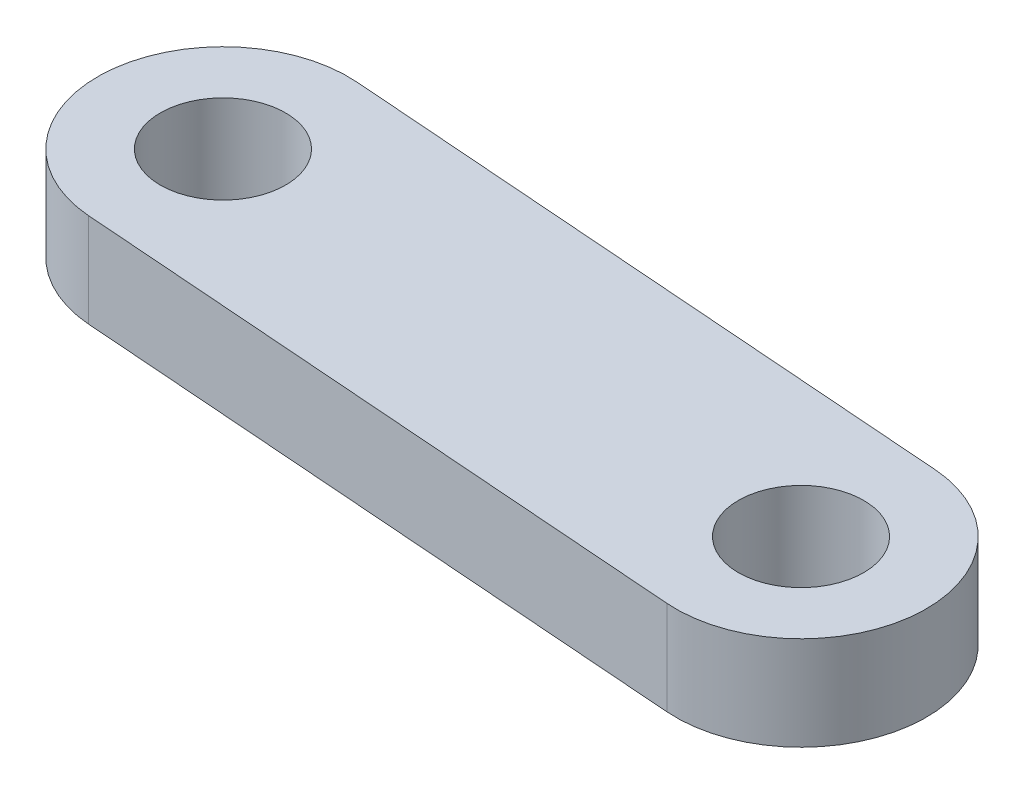
ISO-10303-21;
HEADER;
FILE_DESCRIPTION(('STEP AP214'),'2;1');
FILE_NAME('part.step','',(''),(''),'','','');
FILE_SCHEMA(('AUTOMOTIVE_DESIGN { 1 0 10303 214 1 1 1 1 }'));
ENDSEC;
DATA;
#1=APPLICATION_CONTEXT('core data for automotive mechanical design processes');
#2=APPLICATION_PROTOCOL_DEFINITION('international standard','automotive_design',2000,#1);
#3=PRODUCT_CONTEXT('',#1,'mechanical');
#4=PRODUCT('Part','Part','',(#3));
#5=PRODUCT_RELATED_PRODUCT_CATEGORY('part','',(#4));
#6=PRODUCT_DEFINITION_FORMATION('','',#4);
#7=PRODUCT_DEFINITION_CONTEXT('part definition',#1,'design');
#8=PRODUCT_DEFINITION('design','',#6,#7);
#9=PRODUCT_DEFINITION_SHAPE('','',#8);
#10=(LENGTH_UNIT() NAMED_UNIT(*) SI_UNIT(.MILLI.,.METRE.));
#11=(NAMED_UNIT(*) PLANE_ANGLE_UNIT() SI_UNIT($,.RADIAN.));
#12=(NAMED_UNIT(*) SI_UNIT($,.STERADIAN.) SOLID_ANGLE_UNIT());
#13=UNCERTAINTY_MEASURE_WITH_UNIT(LENGTH_MEASURE(1.E-05),#10,'distance_accuracy_value','');
#14=(GEOMETRIC_REPRESENTATION_CONTEXT(3) GLOBAL_UNCERTAINTY_ASSIGNED_CONTEXT((#13)) GLOBAL_UNIT_ASSIGNED_CONTEXT((#10,
#11,#12)) REPRESENTATION_CONTEXT('',''));
#15=CARTESIAN_POINT('',(0.,0.,0.));
#16=DIRECTION('',(0.,0.,1.));
#17=DIRECTION('',(1.,0.,0.));
#18=AXIS2_PLACEMENT_3D('',#15,#16,#17);
#19=CARTESIAN_POINT('',(61.6464889963824,3.,-142.726974411864));
#20=DIRECTION('',(0.,1.,0.));
#21=DIRECTION('',(0.,0.,1.));
#22=AXIS2_PLACEMENT_3D('',#19,#20,#21);
#23=PLANE('',#22);
#24=CARTESIAN_POINT('',(61.6464889963824,3.,-142.726974411864));
#25=DIRECTION('',(0.,1.,0.));
#26=DIRECTION('',(0.,0.,1.));
#27=AXIS2_PLACEMENT_3D('',#24,#25,#26);
#28=CIRCLE('',#27,1.99999999999998);
#29=CARTESIAN_POINT('',(61.6464889963824,3.,-140.726974411864));
#30=VERTEX_POINT('',#29);
#31=EDGE_CURVE('E110',#30,#30,#28,.T.);
#32=ORIENTED_EDGE('',*,*,#31,.F.);
#33=EDGE_LOOP('',(#32));
#34=FACE_BOUND('',#33,.T.);
#35=CARTESIAN_POINT('',(61.6464889963824,3.,-142.726974411864));
#36=DIRECTION('',(0.,1.,0.));
#37=DIRECTION('',(0.,0.,1.));
#38=AXIS2_PLACEMENT_3D('',#35,#36,#37);
#39=CIRCLE('',#38,3.99999999999994);
#40=CARTESIAN_POINT('',(61.9439310351188,3.,-146.715900111046));
#41=VERTEX_POINT('',#40);
#42=CARTESIAN_POINT('',(61.3490469576461,3.,-138.738048712682));
#43=VERTEX_POINT('',#42);
#44=EDGE_CURVE('E95',#41,#43,#39,.T.);
#45=ORIENTED_EDGE('',*,*,#44,.T.);
#46=DIRECTION('',(0.99723142479543,0.,0.0743605096840877));
#47=VECTOR('',#46,1.);
#48=CARTESIAN_POINT('',(61.3490469576461,3.,-138.738048712682));
#49=LINE('',#48,#47);
#50=CARTESIAN_POINT('',(81.2936754535547,3.,-137.250838519001));
#51=VERTEX_POINT('',#50);
#52=EDGE_CURVE('E90',#43,#51,#49,.T.);
#53=ORIENTED_EDGE('',*,*,#52,.T.);
#54=CARTESIAN_POINT('',(81.591117492291,3.,-141.239764218182));
#55=DIRECTION('',(0.,1.,0.));
#56=DIRECTION('',(0.,0.,1.));
#57=AXIS2_PLACEMENT_3D('',#54,#55,#56);
#58=CIRCLE('',#57,3.99999999999997);
#59=CARTESIAN_POINT('',(81.8885595310274,3.,-145.228689917364));
#60=VERTEX_POINT('',#59);
#61=EDGE_CURVE('E93',#51,#60,#58,.T.);
#62=ORIENTED_EDGE('',*,*,#61,.T.);
#63=DIRECTION('',(-0.99723142479543,0.,-0.0743605096840849));
#64=VECTOR('',#63,1.);
#65=CARTESIAN_POINT('',(61.9439310351188,3.,-146.715900111046));
#66=LINE('',#65,#64);
#67=EDGE_CURVE('E60',#60,#41,#66,.T.);
#68=ORIENTED_EDGE('',*,*,#67,.T.);
#69=EDGE_LOOP('',(#45,#53,#62,#68));
#70=FACE_BOUND('',#69,.T.);
#71=CARTESIAN_POINT('',(81.591117492291,3.,-141.239764218182));
#72=DIRECTION('',(0.,1.,0.));
#73=DIRECTION('',(0.,0.,1.));
#74=AXIS2_PLACEMENT_3D('',#71,#72,#73);
#75=CIRCLE('',#74,2.);
#76=CARTESIAN_POINT('',(81.591117492291,3.,-139.239764218182));
#77=VERTEX_POINT('',#76);
#78=EDGE_CURVE('E125',#77,#77,#75,.T.);
#79=ORIENTED_EDGE('',*,*,#78,.F.);
#80=EDGE_LOOP('',(#79));
#81=FACE_BOUND('',#80,.T.);
#82=ADVANCED_FACE('F43',(#34,#70,#81),#23,.T.);
#83=CARTESIAN_POINT('',(61.6464889963824,0.,-142.726974411864));
#84=DIRECTION('',(0.,1.,0.));
#85=DIRECTION('',(0.,0.,1.));
#86=AXIS2_PLACEMENT_3D('',#83,#84,#85);
#87=PLANE('',#86);
#88=CARTESIAN_POINT('',(61.6464889963824,0.,-142.726974411864));
#89=DIRECTION('',(0.,1.,0.));
#90=DIRECTION('',(0.,0.,1.));
#91=AXIS2_PLACEMENT_3D('',#88,#89,#90);
#92=CIRCLE('',#91,3.99999999999994);
#93=CARTESIAN_POINT('',(61.9439310351188,0.,-146.715900111046));
#94=VERTEX_POINT('',#93);
#95=CARTESIAN_POINT('',(61.3490469576461,0.,-138.738048712682));
#96=VERTEX_POINT('',#95);
#97=EDGE_CURVE('E107',#94,#96,#92,.T.);
#98=ORIENTED_EDGE('',*,*,#97,.F.);
#99=DIRECTION('',(-0.99723142479543,0.,-0.0743605096840849));
#100=VECTOR('',#99,1.);
#101=CARTESIAN_POINT('',(61.9439310351188,0.,-146.715900111046));
#102=LINE('',#101,#100);
#103=CARTESIAN_POINT('',(81.8885595310274,0.,-145.228689917364));
#104=VERTEX_POINT('',#103);
#105=EDGE_CURVE('E83',#104,#94,#102,.T.);
#106=ORIENTED_EDGE('',*,*,#105,.F.);
#107=CARTESIAN_POINT('',(81.591117492291,0.,-141.239764218182));
#108=DIRECTION('',(0.,1.,0.));
#109=DIRECTION('',(0.,0.,1.));
#110=AXIS2_PLACEMENT_3D('',#107,#108,#109);
#111=CIRCLE('',#110,3.99999999999997);
#112=CARTESIAN_POINT('',(81.2936754535547,0.,-137.250838519001));
#113=VERTEX_POINT('',#112);
#114=EDGE_CURVE('E77',#113,#104,#111,.T.);
#115=ORIENTED_EDGE('',*,*,#114,.F.);
#116=DIRECTION('',(0.99723142479543,0.,0.0743605096840877));
#117=VECTOR('',#116,1.);
#118=CARTESIAN_POINT('',(61.3490469576461,0.,-138.738048712682));
#119=LINE('',#118,#117);
#120=EDGE_CURVE('E99',#96,#113,#119,.T.);
#121=ORIENTED_EDGE('',*,*,#120,.F.);
#122=EDGE_LOOP('',(#98,#106,#115,#121));
#123=FACE_BOUND('',#122,.T.);
#124=CARTESIAN_POINT('',(61.6464889963824,0.,-142.726974411864));
#125=DIRECTION('',(0.,1.,0.));
#126=DIRECTION('',(0.,0.,1.));
#127=AXIS2_PLACEMENT_3D('',#124,#125,#126);
#128=CIRCLE('',#127,1.99999999999998);
#129=CARTESIAN_POINT('',(61.6464889963824,0.,-140.726974411864));
#130=VERTEX_POINT('',#129);
#131=EDGE_CURVE('E122',#130,#130,#128,.T.);
#132=ORIENTED_EDGE('',*,*,#131,.T.);
#133=EDGE_LOOP('',(#132));
#134=FACE_BOUND('',#133,.T.);
#135=CARTESIAN_POINT('',(81.591117492291,0.,-141.239764218182));
#136=DIRECTION('',(0.,1.,0.));
#137=DIRECTION('',(0.,0.,1.));
#138=AXIS2_PLACEMENT_3D('',#135,#136,#137);
#139=CIRCLE('',#138,2.);
#140=CARTESIAN_POINT('',(81.591117492291,0.,-139.239764218182));
#141=VERTEX_POINT('',#140);
#142=EDGE_CURVE('E128',#141,#141,#139,.T.);
#143=ORIENTED_EDGE('',*,*,#142,.T.);
#144=EDGE_LOOP('',(#143));
#145=FACE_BOUND('',#144,.T.);
#146=ADVANCED_FACE('F118',(#123,#134,#145),#87,.F.);
#147=CARTESIAN_POINT('',(61.6464889963824,3.,-142.726974411864));
#148=DIRECTION('',(0.,-1.,0.));
#149=DIRECTION('',(0.,0.,-1.));
#150=AXIS2_PLACEMENT_3D('',#147,#148,#149);
#151=CYLINDRICAL_SURFACE('',#150,3.99999999999994);
#152=ORIENTED_EDGE('',*,*,#97,.T.);
#153=DIRECTION('',(0.,-1.,0.));
#154=VECTOR('',#153,1.);
#155=CARTESIAN_POINT('',(61.3490469576461,3.,-138.738048712682));
#156=LINE('',#155,#154);
#157=EDGE_CURVE('E11',#43,#96,#156,.T.);
#158=ORIENTED_EDGE('',*,*,#157,.F.);
#159=ORIENTED_EDGE('',*,*,#44,.F.);
#160=DIRECTION('',(0.,-1.,0.));
#161=VECTOR('',#160,1.);
#162=CARTESIAN_POINT('',(61.9439310351188,3.,-146.715900111046));
#163=LINE('',#162,#161);
#164=EDGE_CURVE('E103',#41,#94,#163,.T.);
#165=ORIENTED_EDGE('',*,*,#164,.T.);
#166=EDGE_LOOP('',(#152,#158,#159,#165));
#167=FACE_BOUND('',#166,.T.);
#168=ADVANCED_FACE('F45',(#167),#151,.T.);
#169=CARTESIAN_POINT('',(61.3490469576461,3.,-138.738048712682));
#170=DIRECTION('',(0.0743605096840877,0.,-0.99723142479543));
#171=DIRECTION('',(-0.99723142479543,0.,-0.0743605096840877));
#172=AXIS2_PLACEMENT_3D('',#169,#170,#171);
#173=PLANE('',#172);
#174=ORIENTED_EDGE('',*,*,#120,.T.);
#175=DIRECTION('',(0.,-1.,0.));
#176=VECTOR('',#175,1.);
#177=CARTESIAN_POINT('',(81.2936754535547,3.,-137.250838519001));
#178=LINE('',#177,#176);
#179=EDGE_CURVE('E52',#51,#113,#178,.T.);
#180=ORIENTED_EDGE('',*,*,#179,.F.);
#181=ORIENTED_EDGE('',*,*,#52,.F.);
#182=ORIENTED_EDGE('',*,*,#157,.T.);
#183=EDGE_LOOP('',(#174,#180,#181,#182));
#184=FACE_BOUND('',#183,.T.);
#185=ADVANCED_FACE('F98',(#184),#173,.F.);
#186=CARTESIAN_POINT('',(81.591117492291,3.,-141.239764218182));
#187=DIRECTION('',(0.,-1.,0.));
#188=DIRECTION('',(0.,0.,-1.));
#189=AXIS2_PLACEMENT_3D('',#186,#187,#188);
#190=CYLINDRICAL_SURFACE('',#189,3.99999999999997);
#191=ORIENTED_EDGE('',*,*,#114,.T.);
#192=DIRECTION('',(0.,-1.,0.));
#193=VECTOR('',#192,1.);
#194=CARTESIAN_POINT('',(81.8885595310274,3.,-145.228689917364));
#195=LINE('',#194,#193);
#196=EDGE_CURVE('E100',#60,#104,#195,.T.);
#197=ORIENTED_EDGE('',*,*,#196,.F.);
#198=ORIENTED_EDGE('',*,*,#61,.F.);
#199=ORIENTED_EDGE('',*,*,#179,.T.);
#200=EDGE_LOOP('',(#191,#197,#198,#199));
#201=FACE_BOUND('',#200,.T.);
#202=ADVANCED_FACE('F101',(#201),#190,.T.);
#203=CARTESIAN_POINT('',(61.9439310351188,3.,-146.715900111046));
#204=DIRECTION('',(-0.0743605096840849,0.,0.99723142479543));
#205=DIRECTION('',(0.99723142479543,0.,0.0743605096840849));
#206=AXIS2_PLACEMENT_3D('',#203,#204,#205);
#207=PLANE('',#206);
#208=ORIENTED_EDGE('',*,*,#105,.T.);
#209=ORIENTED_EDGE('',*,*,#164,.F.);
#210=ORIENTED_EDGE('',*,*,#67,.F.);
#211=ORIENTED_EDGE('',*,*,#196,.T.);
#212=EDGE_LOOP('',(#208,#209,#210,#211));
#213=FACE_BOUND('',#212,.T.);
#214=ADVANCED_FACE('F115',(#213),#207,.F.);
#215=CARTESIAN_POINT('',(61.6464889963824,3.,-142.726974411864));
#216=DIRECTION('',(0.,-1.,0.));
#217=DIRECTION('',(0.,0.,-1.));
#218=AXIS2_PLACEMENT_3D('',#215,#216,#217);
#219=CYLINDRICAL_SURFACE('',#218,1.99999999999998);
#220=ORIENTED_EDGE('',*,*,#31,.T.);
#221=EDGE_LOOP('',(#220));
#222=FACE_BOUND('',#221,.T.);
#223=ORIENTED_EDGE('',*,*,#131,.F.);
#224=EDGE_LOOP('',(#223));
#225=FACE_BOUND('',#224,.T.);
#226=ADVANCED_FACE('F145',(#222,#225),#219,.F.);
#227=CARTESIAN_POINT('',(81.591117492291,3.,-141.239764218182));
#228=DIRECTION('',(0.,-1.,0.));
#229=DIRECTION('',(0.,0.,-1.));
#230=AXIS2_PLACEMENT_3D('',#227,#228,#229);
#231=CYLINDRICAL_SURFACE('',#230,2.);
#232=ORIENTED_EDGE('',*,*,#78,.T.);
#233=EDGE_LOOP('',(#232));
#234=FACE_BOUND('',#233,.T.);
#235=ORIENTED_EDGE('',*,*,#142,.F.);
#236=EDGE_LOOP('',(#235));
#237=FACE_BOUND('',#236,.T.);
#238=ADVANCED_FACE('F134',(#234,#237),#231,.F.);
#239=CLOSED_SHELL('',(#82,#146,#168,#185,#202,#214,#226,#238));
#240=MANIFOLD_SOLID_BREP('B2',#239);
#241=ADVANCED_BREP_SHAPE_REPRESENTATION('',(#18,#240),#14);
#242=SHAPE_DEFINITION_REPRESENTATION(#9,#241);
ENDSEC;
END-ISO-10303-21;
